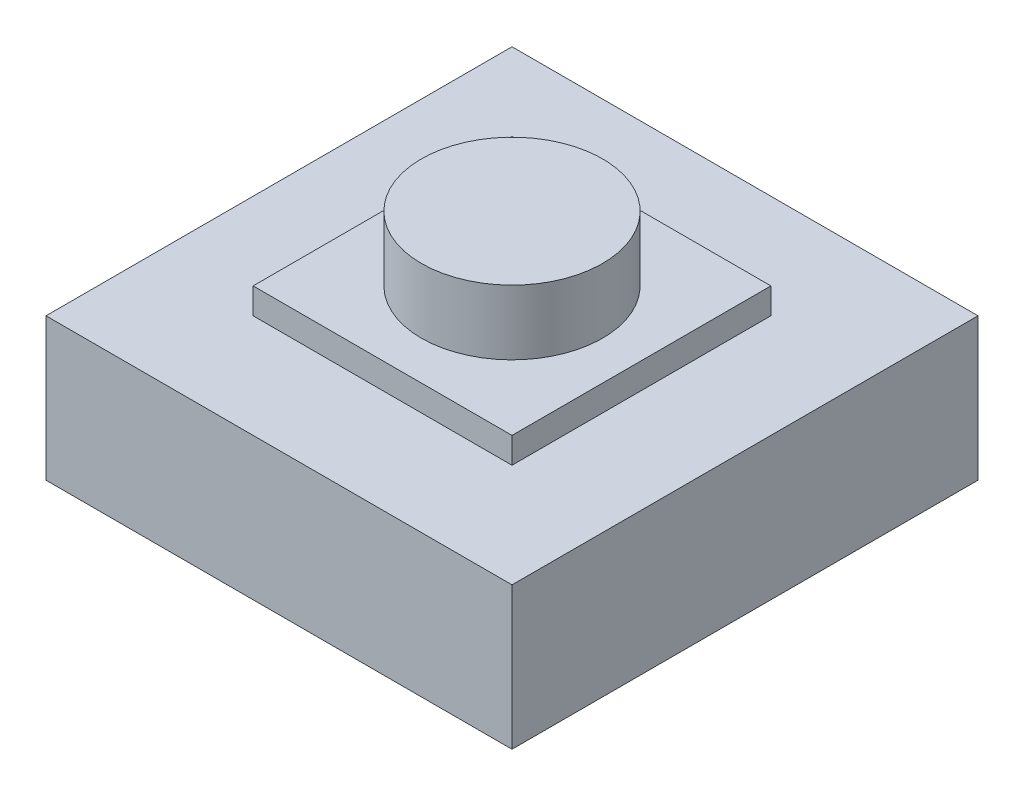
ISO-10303-21;
HEADER;
FILE_DESCRIPTION(('STEP AP214'),'2;1');
FILE_NAME('part.step','',(''),(''),'','','');
FILE_SCHEMA(('AUTOMOTIVE_DESIGN { 1 0 10303 214 1 1 1 1 }'));
ENDSEC;
DATA;
#1=APPLICATION_CONTEXT('core data for automotive mechanical design processes');
#2=APPLICATION_PROTOCOL_DEFINITION('international standard','automotive_design',2000,#1);
#3=PRODUCT_CONTEXT('',#1,'mechanical');
#4=PRODUCT('Part','Part','',(#3));
#5=PRODUCT_RELATED_PRODUCT_CATEGORY('part','',(#4));
#6=PRODUCT_DEFINITION_FORMATION('','',#4);
#7=PRODUCT_DEFINITION_CONTEXT('part definition',#1,'design');
#8=PRODUCT_DEFINITION('design','',#6,#7);
#9=PRODUCT_DEFINITION_SHAPE('','',#8);
#10=(LENGTH_UNIT() NAMED_UNIT(*) SI_UNIT(.MILLI.,.METRE.));
#11=(NAMED_UNIT(*) PLANE_ANGLE_UNIT() SI_UNIT($,.RADIAN.));
#12=(NAMED_UNIT(*) SI_UNIT($,.STERADIAN.) SOLID_ANGLE_UNIT());
#13=UNCERTAINTY_MEASURE_WITH_UNIT(LENGTH_MEASURE(1.E-05),#10,'distance_accuracy_value','');
#14=(GEOMETRIC_REPRESENTATION_CONTEXT(3) GLOBAL_UNCERTAINTY_ASSIGNED_CONTEXT((#13)) GLOBAL_UNIT_ASSIGNED_CONTEXT((#10,
#11,#12)) REPRESENTATION_CONTEXT('',''));
#15=CARTESIAN_POINT('',(0.,0.,0.));
#16=DIRECTION('',(0.,0.,1.));
#17=DIRECTION('',(1.,0.,0.));
#18=AXIS2_PLACEMENT_3D('',#15,#16,#17);
#19=CARTESIAN_POINT('',(0.,11.,0.));
#20=DIRECTION('',(0.,-1.,0.));
#21=DIRECTION('',(0.,0.,-1.));
#22=AXIS2_PLACEMENT_3D('',#19,#20,#21);
#23=PLANE('',#22);
#24=DIRECTION('',(0.,0.,-1.));
#25=VECTOR('',#24,1.);
#26=CARTESIAN_POINT('',(18.,11.,18.));
#27=LINE('',#26,#25);
#28=CARTESIAN_POINT('',(18.,11.,18.));
#29=VERTEX_POINT('',#28);
#30=CARTESIAN_POINT('',(18.,11.,-18.));
#31=VERTEX_POINT('',#30);
#32=EDGE_CURVE('E144',#29,#31,#27,.T.);
#33=ORIENTED_EDGE('',*,*,#32,.T.);
#34=DIRECTION('',(-1.,0.,0.));
#35=VECTOR('',#34,1.);
#36=CARTESIAN_POINT('',(-18.,11.,-18.));
#37=LINE('',#36,#35);
#38=CARTESIAN_POINT('',(-18.,11.,-18.));
#39=VERTEX_POINT('',#38);
#40=EDGE_CURVE('E148',#31,#39,#37,.T.);
#41=ORIENTED_EDGE('',*,*,#40,.T.);
#42=DIRECTION('',(0.,0.,1.));
#43=VECTOR('',#42,1.);
#44=CARTESIAN_POINT('',(-18.,11.,18.));
#45=LINE('',#44,#43);
#46=CARTESIAN_POINT('',(-18.,11.,18.));
#47=VERTEX_POINT('',#46);
#48=EDGE_CURVE('E152',#39,#47,#45,.T.);
#49=ORIENTED_EDGE('',*,*,#48,.T.);
#50=DIRECTION('',(1.,0.,0.));
#51=VECTOR('',#50,1.);
#52=CARTESIAN_POINT('',(-18.,11.,18.));
#53=LINE('',#52,#51);
#54=EDGE_CURVE('E155',#47,#29,#53,.T.);
#55=ORIENTED_EDGE('',*,*,#54,.T.);
#56=EDGE_LOOP('',(#33,#41,#49,#55));
#57=FACE_BOUND('',#56,.T.);
#58=DIRECTION('',(0.,0.,1.));
#59=VECTOR('',#58,1.);
#60=CARTESIAN_POINT('',(-10.,11.,-9.99999999999999));
#61=LINE('',#60,#59);
#62=CARTESIAN_POINT('',(-10.,11.,-9.99999999999999));
#63=VERTEX_POINT('',#62);
#64=CARTESIAN_POINT('',(-10.,11.,10.));
#65=VERTEX_POINT('',#64);
#66=EDGE_CURVE('E60',#63,#65,#61,.T.);
#67=ORIENTED_EDGE('',*,*,#66,.F.);
#68=DIRECTION('',(-1.,0.,0.));
#69=VECTOR('',#68,1.);
#70=CARTESIAN_POINT('',(10.,11.,-10.));
#71=LINE('',#70,#69);
#72=CARTESIAN_POINT('',(10.,11.,-10.));
#73=VERTEX_POINT('',#72);
#74=EDGE_CURVE('E64',#73,#63,#71,.T.);
#75=ORIENTED_EDGE('',*,*,#74,.F.);
#76=DIRECTION('',(0.,0.,-1.));
#77=VECTOR('',#76,1.);
#78=CARTESIAN_POINT('',(10.,11.,-10.));
#79=LINE('',#78,#77);
#80=CARTESIAN_POINT('',(10.,11.,10.));
#81=VERTEX_POINT('',#80);
#82=EDGE_CURVE('E350',#81,#73,#79,.T.);
#83=ORIENTED_EDGE('',*,*,#82,.F.);
#84=DIRECTION('',(1.,0.,0.));
#85=VECTOR('',#84,1.);
#86=CARTESIAN_POINT('',(10.,11.,10.));
#87=LINE('',#86,#85);
#88=EDGE_CURVE('E340',#65,#81,#87,.T.);
#89=ORIENTED_EDGE('',*,*,#88,.F.);
#90=EDGE_LOOP('',(#67,#75,#83,#89));
#91=FACE_BOUND('',#90,.T.);
#92=ADVANCED_FACE('F43',(#57,#91),#23,.F.);
#93=CARTESIAN_POINT('',(18.,11.,18.));
#94=DIRECTION('',(-1.,0.,0.));
#95=DIRECTION('',(0.,0.,1.));
#96=AXIS2_PLACEMENT_3D('',#93,#94,#95);
#97=PLANE('',#96);
#98=DIRECTION('',(0.,0.,-1.));
#99=VECTOR('',#98,1.);
#100=CARTESIAN_POINT('',(18.,0.,18.));
#101=LINE('',#100,#99);
#102=CARTESIAN_POINT('',(18.,0.,18.));
#103=VERTEX_POINT('',#102);
#104=CARTESIAN_POINT('',(18.,0.,-18.));
#105=VERTEX_POINT('',#104);
#106=EDGE_CURVE('E133',#103,#105,#101,.T.);
#107=ORIENTED_EDGE('',*,*,#106,.T.);
#108=DIRECTION('',(0.,-1.,0.));
#109=VECTOR('',#108,1.);
#110=CARTESIAN_POINT('',(18.,11.,-18.));
#111=LINE('',#110,#109);
#112=EDGE_CURVE('E47',#31,#105,#111,.T.);
#113=ORIENTED_EDGE('',*,*,#112,.F.);
#114=ORIENTED_EDGE('',*,*,#32,.F.);
#115=DIRECTION('',(0.,-1.,0.));
#116=VECTOR('',#115,1.);
#117=CARTESIAN_POINT('',(18.,11.,18.));
#118=LINE('',#117,#116);
#119=EDGE_CURVE('E157',#29,#103,#118,.T.);
#120=ORIENTED_EDGE('',*,*,#119,.T.);
#121=EDGE_LOOP('',(#107,#113,#114,#120));
#122=FACE_BOUND('',#121,.T.);
#123=ADVANCED_FACE('F45',(#122),#97,.F.);
#124=CARTESIAN_POINT('',(-18.,11.,-18.));
#125=DIRECTION('',(0.,0.,1.));
#126=DIRECTION('',(1.,0.,0.));
#127=AXIS2_PLACEMENT_3D('',#124,#125,#126);
#128=PLANE('',#127);
#129=DIRECTION('',(-1.,0.,0.));
#130=VECTOR('',#129,1.);
#131=CARTESIAN_POINT('',(-18.,0.,-18.));
#132=LINE('',#131,#130);
#133=CARTESIAN_POINT('',(-18.,0.,-18.));
#134=VERTEX_POINT('',#133);
#135=EDGE_CURVE('E138',#105,#134,#132,.T.);
#136=ORIENTED_EDGE('',*,*,#135,.T.);
#137=DIRECTION('',(0.,-1.,0.));
#138=VECTOR('',#137,1.);
#139=CARTESIAN_POINT('',(-18.,11.,-18.));
#140=LINE('',#139,#138);
#141=EDGE_CURVE('E172',#39,#134,#140,.T.);
#142=ORIENTED_EDGE('',*,*,#141,.F.);
#143=ORIENTED_EDGE('',*,*,#40,.F.);
#144=ORIENTED_EDGE('',*,*,#112,.T.);
#145=EDGE_LOOP('',(#136,#142,#143,#144));
#146=FACE_BOUND('',#145,.T.);
#147=ADVANCED_FACE('F183',(#146),#128,.F.);
#148=CARTESIAN_POINT('',(-18.,11.,18.));
#149=DIRECTION('',(1.,0.,0.));
#150=DIRECTION('',(0.,0.,-1.));
#151=AXIS2_PLACEMENT_3D('',#148,#149,#150);
#152=PLANE('',#151);
#153=DIRECTION('',(0.,0.,1.));
#154=VECTOR('',#153,1.);
#155=CARTESIAN_POINT('',(-18.,0.,18.));
#156=LINE('',#155,#154);
#157=CARTESIAN_POINT('',(-18.,0.,18.));
#158=VERTEX_POINT('',#157);
#159=EDGE_CURVE('E161',#134,#158,#156,.T.);
#160=ORIENTED_EDGE('',*,*,#159,.T.);
#161=DIRECTION('',(0.,-1.,0.));
#162=VECTOR('',#161,1.);
#163=CARTESIAN_POINT('',(-18.,11.,18.));
#164=LINE('',#163,#162);
#165=EDGE_CURVE('E169',#47,#158,#164,.T.);
#166=ORIENTED_EDGE('',*,*,#165,.F.);
#167=ORIENTED_EDGE('',*,*,#48,.F.);
#168=ORIENTED_EDGE('',*,*,#141,.T.);
#169=EDGE_LOOP('',(#160,#166,#167,#168));
#170=FACE_BOUND('',#169,.T.);
#171=ADVANCED_FACE('F192',(#170),#152,.F.);
#172=CARTESIAN_POINT('',(-18.,11.,18.));
#173=DIRECTION('',(0.,0.,-1.));
#174=DIRECTION('',(-1.,0.,0.));
#175=AXIS2_PLACEMENT_3D('',#172,#173,#174);
#176=PLANE('',#175);
#177=DIRECTION('',(1.,0.,0.));
#178=VECTOR('',#177,1.);
#179=CARTESIAN_POINT('',(-18.,0.,18.));
#180=LINE('',#179,#178);
#181=EDGE_CURVE('E149',#158,#103,#180,.T.);
#182=ORIENTED_EDGE('',*,*,#181,.T.);
#183=ORIENTED_EDGE('',*,*,#119,.F.);
#184=ORIENTED_EDGE('',*,*,#54,.F.);
#185=ORIENTED_EDGE('',*,*,#165,.T.);
#186=EDGE_LOOP('',(#182,#183,#184,#185));
#187=FACE_BOUND('',#186,.T.);
#188=ADVANCED_FACE('F195',(#187),#176,.F.);
#189=CARTESIAN_POINT('',(0.,0.,0.));
#190=DIRECTION('',(0.,-1.,0.));
#191=DIRECTION('',(0.,0.,-1.));
#192=AXIS2_PLACEMENT_3D('',#189,#190,#191);
#193=PLANE('',#192);
#194=ORIENTED_EDGE('',*,*,#106,.F.);
#195=ORIENTED_EDGE('',*,*,#181,.F.);
#196=ORIENTED_EDGE('',*,*,#159,.F.);
#197=ORIENTED_EDGE('',*,*,#135,.F.);
#198=EDGE_LOOP('',(#194,#195,#196,#197));
#199=FACE_BOUND('',#198,.T.);
#200=ADVANCED_FACE('F190',(#199),#193,.T.);
#201=CARTESIAN_POINT('',(-10.,13.,-9.99999999999999));
#202=DIRECTION('',(1.,0.,0.));
#203=DIRECTION('',(0.,0.,-1.));
#204=AXIS2_PLACEMENT_3D('',#201,#202,#203);
#205=PLANE('',#204);
#206=ORIENTED_EDGE('',*,*,#66,.T.);
#207=DIRECTION('',(0.,-1.,0.));
#208=VECTOR('',#207,1.);
#209=CARTESIAN_POINT('',(-10.,13.,10.));
#210=LINE('',#209,#208);
#211=CARTESIAN_POINT('',(-10.,13.,10.));
#212=VERTEX_POINT('',#211);
#213=EDGE_CURVE('E113',#212,#65,#210,.T.);
#214=ORIENTED_EDGE('',*,*,#213,.F.);
#215=DIRECTION('',(0.,0.,1.));
#216=VECTOR('',#215,1.);
#217=CARTESIAN_POINT('',(-10.,13.,-9.99999999999999));
#218=LINE('',#217,#216);
#219=CARTESIAN_POINT('',(-10.,13.,-9.99999999999999));
#220=VERTEX_POINT('',#219);
#221=EDGE_CURVE('E120',#220,#212,#218,.T.);
#222=ORIENTED_EDGE('',*,*,#221,.F.);
#223=DIRECTION('',(0.,-1.,0.));
#224=VECTOR('',#223,1.);
#225=CARTESIAN_POINT('',(-10.,13.,-9.99999999999999));
#226=LINE('',#225,#224);
#227=EDGE_CURVE('E346',#220,#63,#226,.T.);
#228=ORIENTED_EDGE('',*,*,#227,.T.);
#229=EDGE_LOOP('',(#206,#214,#222,#228));
#230=FACE_BOUND('',#229,.T.);
#231=ADVANCED_FACE('F131',(#230),#205,.F.);
#232=CARTESIAN_POINT('',(10.,13.,10.));
#233=DIRECTION('',(0.,0.,-1.));
#234=DIRECTION('',(-1.,0.,0.));
#235=AXIS2_PLACEMENT_3D('',#232,#233,#234);
#236=PLANE('',#235);
#237=ORIENTED_EDGE('',*,*,#88,.T.);
#238=DIRECTION('',(0.,-1.,0.));
#239=VECTOR('',#238,1.);
#240=CARTESIAN_POINT('',(10.,13.,10.));
#241=LINE('',#240,#239);
#242=CARTESIAN_POINT('',(10.,13.,10.));
#243=VERTEX_POINT('',#242);
#244=EDGE_CURVE('E115',#243,#81,#241,.T.);
#245=ORIENTED_EDGE('',*,*,#244,.F.);
#246=DIRECTION('',(1.,0.,0.));
#247=VECTOR('',#246,1.);
#248=CARTESIAN_POINT('',(10.,13.,10.));
#249=LINE('',#248,#247);
#250=EDGE_CURVE('E108',#212,#243,#249,.T.);
#251=ORIENTED_EDGE('',*,*,#250,.F.);
#252=ORIENTED_EDGE('',*,*,#213,.T.);
#253=EDGE_LOOP('',(#237,#245,#251,#252));
#254=FACE_BOUND('',#253,.T.);
#255=ADVANCED_FACE('F111',(#254),#236,.F.);
#256=CARTESIAN_POINT('',(10.,13.,-10.));
#257=DIRECTION('',(-1.,0.,0.));
#258=DIRECTION('',(0.,0.,1.));
#259=AXIS2_PLACEMENT_3D('',#256,#257,#258);
#260=PLANE('',#259);
#261=ORIENTED_EDGE('',*,*,#82,.T.);
#262=DIRECTION('',(0.,-1.,0.));
#263=VECTOR('',#262,1.);
#264=CARTESIAN_POINT('',(10.,13.,-10.));
#265=LINE('',#264,#263);
#266=CARTESIAN_POINT('',(10.,13.,-10.));
#267=VERTEX_POINT('',#266);
#268=EDGE_CURVE('E140',#267,#73,#265,.T.);
#269=ORIENTED_EDGE('',*,*,#268,.F.);
#270=DIRECTION('',(0.,0.,-1.));
#271=VECTOR('',#270,1.);
#272=CARTESIAN_POINT('',(10.,13.,-10.));
#273=LINE('',#272,#271);
#274=EDGE_CURVE('E119',#243,#267,#273,.T.);
#275=ORIENTED_EDGE('',*,*,#274,.F.);
#276=ORIENTED_EDGE('',*,*,#244,.T.);
#277=EDGE_LOOP('',(#261,#269,#275,#276));
#278=FACE_BOUND('',#277,.T.);
#279=ADVANCED_FACE('F238',(#278),#260,.F.);
#280=CARTESIAN_POINT('',(10.,13.,-10.));
#281=DIRECTION('',(0.,0.,1.));
#282=DIRECTION('',(1.,0.,0.));
#283=AXIS2_PLACEMENT_3D('',#280,#281,#282);
#284=PLANE('',#283);
#285=ORIENTED_EDGE('',*,*,#74,.T.);
#286=ORIENTED_EDGE('',*,*,#227,.F.);
#287=DIRECTION('',(-1.,0.,0.));
#288=VECTOR('',#287,1.);
#289=CARTESIAN_POINT('',(10.,13.,-10.));
#290=LINE('',#289,#288);
#291=EDGE_CURVE('E125',#267,#220,#290,.T.);
#292=ORIENTED_EDGE('',*,*,#291,.F.);
#293=ORIENTED_EDGE('',*,*,#268,.T.);
#294=EDGE_LOOP('',(#285,#286,#292,#293));
#295=FACE_BOUND('',#294,.T.);
#296=ADVANCED_FACE('F244',(#295),#284,.F.);
#297=CARTESIAN_POINT('',(0.,13.,0.));
#298=DIRECTION('',(0.,-1.,0.));
#299=DIRECTION('',(0.,0.,-1.));
#300=AXIS2_PLACEMENT_3D('',#297,#298,#299);
#301=PLANE('',#300);
#302=CARTESIAN_POINT('',(0.,13.,0.));
#303=DIRECTION('',(0.,1.,0.));
#304=DIRECTION('',(0.,0.,1.));
#305=AXIS2_PLACEMENT_3D('',#302,#303,#304);
#306=CIRCLE('',#305,7.);
#307=CARTESIAN_POINT('',(0.,13.,7.));
#308=VERTEX_POINT('',#307);
#309=EDGE_CURVE('E11',#308,#308,#306,.T.);
#310=ORIENTED_EDGE('',*,*,#309,.F.);
#311=EDGE_LOOP('',(#310));
#312=FACE_BOUND('',#311,.T.);
#313=ORIENTED_EDGE('',*,*,#221,.T.);
#314=ORIENTED_EDGE('',*,*,#250,.T.);
#315=ORIENTED_EDGE('',*,*,#274,.T.);
#316=ORIENTED_EDGE('',*,*,#291,.T.);
#317=EDGE_LOOP('',(#313,#314,#315,#316));
#318=FACE_BOUND('',#317,.T.);
#319=ADVANCED_FACE('F123',(#312,#318),#301,.F.);
#320=CARTESIAN_POINT('',(0.,18.,0.));
#321=DIRECTION('',(0.,-1.,0.));
#322=DIRECTION('',(0.,0.,-1.));
#323=AXIS2_PLACEMENT_3D('',#320,#321,#322);
#324=CYLINDRICAL_SURFACE('',#323,7.);
#325=CARTESIAN_POINT('',(0.,18.,0.));
#326=DIRECTION('',(0.,1.,0.));
#327=DIRECTION('',(0.,0.,1.));
#328=AXIS2_PLACEMENT_3D('',#325,#326,#327);
#329=CIRCLE('',#328,7.);
#330=CARTESIAN_POINT('',(0.,18.,7.));
#331=VERTEX_POINT('',#330);
#332=EDGE_CURVE('E336',#331,#331,#329,.T.);
#333=ORIENTED_EDGE('',*,*,#332,.F.);
#334=EDGE_LOOP('',(#333));
#335=FACE_BOUND('',#334,.T.);
#336=ORIENTED_EDGE('',*,*,#309,.T.);
#337=EDGE_LOOP('',(#336));
#338=FACE_BOUND('',#337,.T.);
#339=ADVANCED_FACE('F259',(#335,#338),#324,.T.);
#340=CARTESIAN_POINT('',(0.,18.,0.));
#341=DIRECTION('',(0.,1.,0.));
#342=DIRECTION('',(0.,0.,1.));
#343=AXIS2_PLACEMENT_3D('',#340,#341,#342);
#344=PLANE('',#343);
#345=ORIENTED_EDGE('',*,*,#332,.T.);
#346=EDGE_LOOP('',(#345));
#347=FACE_BOUND('',#346,.T.);
#348=ADVANCED_FACE('F267',(#347),#344,.T.);
#349=CLOSED_SHELL('',(#92,#123,#147,#171,#188,#200,#231,#255,#279,#296,#319,#339,#348));
#350=MANIFOLD_SOLID_BREP('B2',#349);
#351=ADVANCED_BREP_SHAPE_REPRESENTATION('',(#18,#350),#14);
#352=SHAPE_DEFINITION_REPRESENTATION(#9,#351);
ENDSEC;
END-ISO-10303-21;
